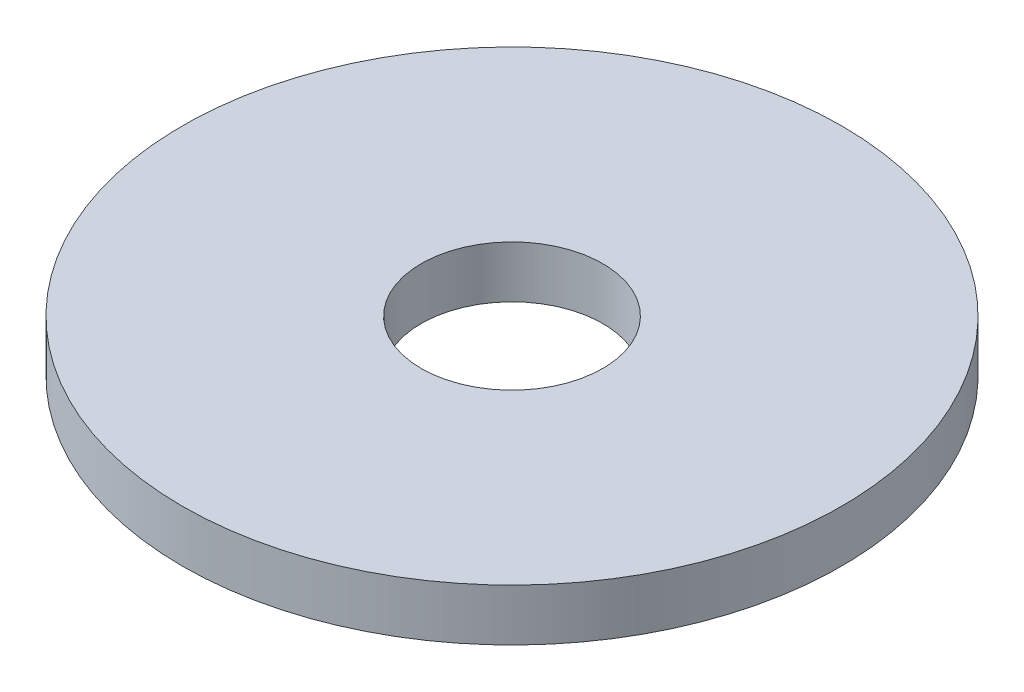
ISO-10303-21;
HEADER;
FILE_DESCRIPTION(('STEP AP214'),'2;1');
FILE_NAME('part.step','',(''),(''),'','','');
FILE_SCHEMA(('AUTOMOTIVE_DESIGN { 1 0 10303 214 1 1 1 1 }'));
ENDSEC;
DATA;
#1=APPLICATION_CONTEXT('core data for automotive mechanical design processes');
#2=APPLICATION_PROTOCOL_DEFINITION('international standard','automotive_design',2000,#1);
#3=PRODUCT_CONTEXT('',#1,'mechanical');
#4=PRODUCT('Part','Part','',(#3));
#5=PRODUCT_RELATED_PRODUCT_CATEGORY('part','',(#4));
#6=PRODUCT_DEFINITION_FORMATION('','',#4);
#7=PRODUCT_DEFINITION_CONTEXT('part definition',#1,'design');
#8=PRODUCT_DEFINITION('design','',#6,#7);
#9=PRODUCT_DEFINITION_SHAPE('','',#8);
#10=(LENGTH_UNIT() NAMED_UNIT(*) SI_UNIT(.MILLI.,.METRE.));
#11=(NAMED_UNIT(*) PLANE_ANGLE_UNIT() SI_UNIT($,.RADIAN.));
#12=(NAMED_UNIT(*) SI_UNIT($,.STERADIAN.) SOLID_ANGLE_UNIT());
#13=UNCERTAINTY_MEASURE_WITH_UNIT(LENGTH_MEASURE(1.E-05),#10,'distance_accuracy_value','');
#14=(GEOMETRIC_REPRESENTATION_CONTEXT(3) GLOBAL_UNCERTAINTY_ASSIGNED_CONTEXT((#13)) GLOBAL_UNIT_ASSIGNED_CONTEXT((#10,
#11,#12)) REPRESENTATION_CONTEXT('',''));
#15=CARTESIAN_POINT('',(0.,0.,0.));
#16=DIRECTION('',(0.,0.,1.));
#17=DIRECTION('',(1.,0.,0.));
#18=AXIS2_PLACEMENT_3D('',#15,#16,#17);
#19=CARTESIAN_POINT('',(0.,2.,0.));
#20=DIRECTION('',(0.,-1.,0.));
#21=DIRECTION('',(0.,0.,-1.));
#22=AXIS2_PLACEMENT_3D('',#19,#20,#21);
#23=CYLINDRICAL_SURFACE('',#22,12.7);
#24=CARTESIAN_POINT('',(0.,2.,0.));
#25=DIRECTION('',(0.,1.,0.));
#26=DIRECTION('',(0.,0.,1.));
#27=AXIS2_PLACEMENT_3D('',#24,#25,#26);
#28=CIRCLE('',#27,12.7);
#29=CARTESIAN_POINT('',(0.,2.,12.7));
#30=VERTEX_POINT('',#29);
#31=EDGE_CURVE('E10',#30,#30,#28,.T.);
#32=ORIENTED_EDGE('',*,*,#31,.F.);
#33=EDGE_LOOP('',(#32));
#34=FACE_BOUND('',#33,.T.);
#35=CARTESIAN_POINT('',(0.,0.,0.));
#36=DIRECTION('',(0.,1.,0.));
#37=DIRECTION('',(0.,0.,1.));
#38=AXIS2_PLACEMENT_3D('',#35,#36,#37);
#39=CIRCLE('',#38,12.7);
#40=CARTESIAN_POINT('',(0.,0.,12.7));
#41=VERTEX_POINT('',#40);
#42=EDGE_CURVE('E34',#41,#41,#39,.T.);
#43=ORIENTED_EDGE('',*,*,#42,.T.);
#44=EDGE_LOOP('',(#43));
#45=FACE_BOUND('',#44,.T.);
#46=ADVANCED_FACE('F31',(#34,#45),#23,.T.);
#47=CARTESIAN_POINT('',(0.,2.,0.));
#48=DIRECTION('',(0.,1.,0.));
#49=DIRECTION('',(0.,0.,1.));
#50=AXIS2_PLACEMENT_3D('',#47,#48,#49);
#51=PLANE('',#50);
#52=CARTESIAN_POINT('',(0.,2.,0.));
#53=DIRECTION('',(0.,1.,0.));
#54=DIRECTION('',(0.,0.,1.));
#55=AXIS2_PLACEMENT_3D('',#52,#53,#54);
#56=CIRCLE('',#55,3.5);
#57=CARTESIAN_POINT('',(0.,2.,3.5));
#58=VERTEX_POINT('',#57);
#59=EDGE_CURVE('E43',#58,#58,#56,.T.);
#60=ORIENTED_EDGE('',*,*,#59,.F.);
#61=EDGE_LOOP('',(#60));
#62=FACE_BOUND('',#61,.T.);
#63=ORIENTED_EDGE('',*,*,#31,.T.);
#64=EDGE_LOOP('',(#63));
#65=FACE_BOUND('',#64,.T.);
#66=ADVANCED_FACE('F58',(#62,#65),#51,.T.);
#67=CARTESIAN_POINT('',(0.,0.,0.));
#68=DIRECTION('',(0.,1.,0.));
#69=DIRECTION('',(0.,0.,1.));
#70=AXIS2_PLACEMENT_3D('',#67,#68,#69);
#71=PLANE('',#70);
#72=CARTESIAN_POINT('',(0.,0.,0.));
#73=DIRECTION('',(0.,1.,0.));
#74=DIRECTION('',(0.,0.,1.));
#75=AXIS2_PLACEMENT_3D('',#72,#73,#74);
#76=CIRCLE('',#75,3.5);
#77=CARTESIAN_POINT('',(0.,0.,3.5));
#78=VERTEX_POINT('',#77);
#79=EDGE_CURVE('E41',#78,#78,#76,.T.);
#80=ORIENTED_EDGE('',*,*,#79,.T.);
#81=EDGE_LOOP('',(#80));
#82=FACE_BOUND('',#81,.T.);
#83=ORIENTED_EDGE('',*,*,#42,.F.);
#84=EDGE_LOOP('',(#83));
#85=FACE_BOUND('',#84,.T.);
#86=ADVANCED_FACE('F49',(#82,#85),#71,.F.);
#87=CARTESIAN_POINT('',(0.,0.,0.));
#88=DIRECTION('',(0.,1.,0.));
#89=DIRECTION('',(0.,0.,1.));
#90=AXIS2_PLACEMENT_3D('',#87,#88,#89);
#91=CYLINDRICAL_SURFACE('',#90,3.5);
#92=ORIENTED_EDGE('',*,*,#79,.F.);
#93=EDGE_LOOP('',(#92));
#94=FACE_BOUND('',#93,.T.);
#95=ORIENTED_EDGE('',*,*,#59,.T.);
#96=EDGE_LOOP('',(#95));
#97=FACE_BOUND('',#96,.T.);
#98=ADVANCED_FACE('F52',(#94,#97),#91,.F.);
#99=CLOSED_SHELL('',(#46,#66,#86,#98));
#100=MANIFOLD_SOLID_BREP('B2',#99);
#101=ADVANCED_BREP_SHAPE_REPRESENTATION('',(#18,#100),#14);
#102=SHAPE_DEFINITION_REPRESENTATION(#9,#101);
ENDSEC;
END-ISO-10303-21;
